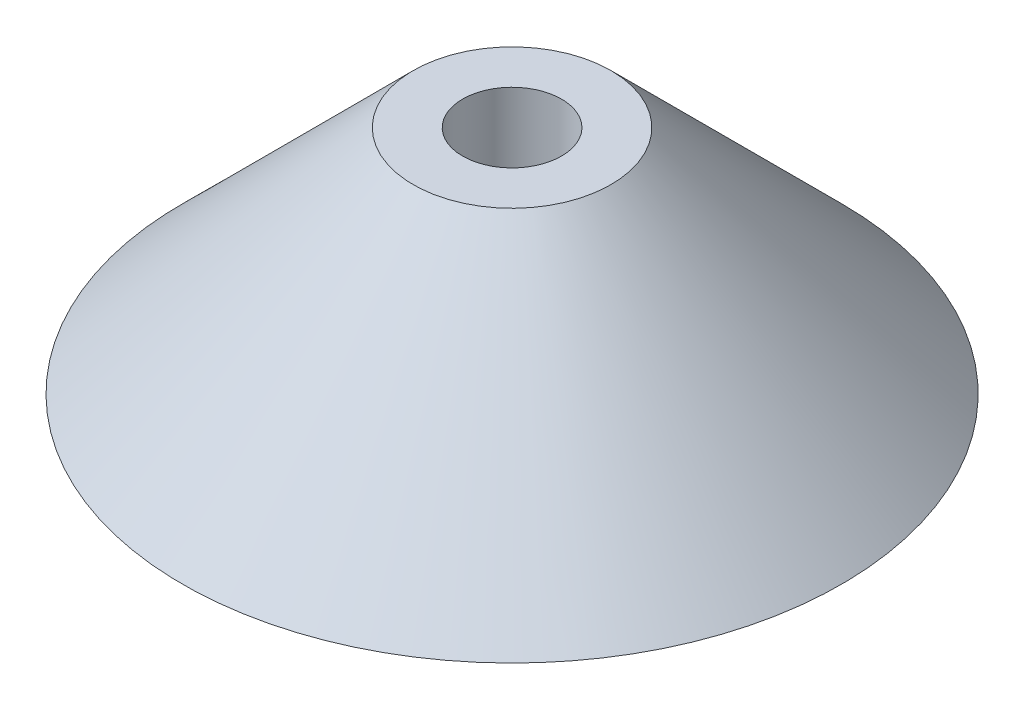
ISO-10303-21;
HEADER;
FILE_DESCRIPTION(('STEP AP214'),'2;1');
FILE_NAME('part.step','',(''),(''),'','','');
FILE_SCHEMA(('AUTOMOTIVE_DESIGN { 1 0 10303 214 1 1 1 1 }'));
ENDSEC;
DATA;
#1=APPLICATION_CONTEXT('core data for automotive mechanical design processes');
#2=APPLICATION_PROTOCOL_DEFINITION('international standard','automotive_design',2000,#1);
#3=PRODUCT_CONTEXT('',#1,'mechanical');
#4=PRODUCT('Part','Part','',(#3));
#5=PRODUCT_RELATED_PRODUCT_CATEGORY('part','',(#4));
#6=PRODUCT_DEFINITION_FORMATION('','',#4);
#7=PRODUCT_DEFINITION_CONTEXT('part definition',#1,'design');
#8=PRODUCT_DEFINITION('design','',#6,#7);
#9=PRODUCT_DEFINITION_SHAPE('','',#8);
#10=(LENGTH_UNIT() NAMED_UNIT(*) SI_UNIT(.MILLI.,.METRE.));
#11=(NAMED_UNIT(*) PLANE_ANGLE_UNIT() SI_UNIT($,.RADIAN.));
#12=(NAMED_UNIT(*) SI_UNIT($,.STERADIAN.) SOLID_ANGLE_UNIT());
#13=UNCERTAINTY_MEASURE_WITH_UNIT(LENGTH_MEASURE(1.E-05),#10,'distance_accuracy_value','');
#14=(GEOMETRIC_REPRESENTATION_CONTEXT(3) GLOBAL_UNCERTAINTY_ASSIGNED_CONTEXT((#13)) GLOBAL_UNIT_ASSIGNED_CONTEXT((#10,
#11,#12)) REPRESENTATION_CONTEXT('',''));
#15=CARTESIAN_POINT('',(0.,0.,0.));
#16=DIRECTION('',(0.,0.,1.));
#17=DIRECTION('',(1.,0.,0.));
#18=AXIS2_PLACEMENT_3D('',#15,#16,#17);
#19=CARTESIAN_POINT('',(0.,7.,0.));
#20=DIRECTION('',(0.,1.,0.));
#21=DIRECTION('',(0.,0.,1.));
#22=AXIS2_PLACEMENT_3D('',#19,#20,#21);
#23=PLANE('',#22);
#24=CARTESIAN_POINT('',(0.,7.,0.));
#25=DIRECTION('',(0.,1.,0.));
#26=DIRECTION('',(0.,0.,1.));
#27=AXIS2_PLACEMENT_3D('',#24,#25,#26);
#28=CIRCLE('',#27,1.5);
#29=CARTESIAN_POINT('',(0.,7.,1.5));
#30=VERTEX_POINT('',#29);
#31=EDGE_CURVE('E46',#30,#30,#28,.T.);
#32=ORIENTED_EDGE('',*,*,#31,.F.);
#33=EDGE_LOOP('',(#32));
#34=FACE_BOUND('',#33,.T.);
#35=CARTESIAN_POINT('',(0.,7.,0.));
#36=DIRECTION('',(0.,1.,0.));
#37=DIRECTION('',(0.,0.,1.));
#38=AXIS2_PLACEMENT_3D('',#35,#36,#37);
#39=CIRCLE('',#38,3.00000000000001);
#40=CARTESIAN_POINT('',(0.,7.,-3.00000000000001));
#41=VERTEX_POINT('',#40);
#42=EDGE_CURVE('E10',#41,#41,#39,.T.);
#43=ORIENTED_EDGE('',*,*,#42,.T.);
#44=EDGE_LOOP('',(#43));
#45=FACE_BOUND('',#44,.T.);
#46=ADVANCED_FACE('F31',(#34,#45),#23,.T.);
#47=CARTESIAN_POINT('',(0.,0.,0.));
#48=DIRECTION('',(0.,1.,0.));
#49=DIRECTION('',(0.,0.,1.));
#50=AXIS2_PLACEMENT_3D('',#47,#48,#49);
#51=PLANE('',#50);
#52=CARTESIAN_POINT('',(0.,0.,0.));
#53=DIRECTION('',(0.,1.,0.));
#54=DIRECTION('',(0.,0.,1.));
#55=AXIS2_PLACEMENT_3D('',#52,#53,#54);
#56=CIRCLE('',#55,1.5);
#57=CARTESIAN_POINT('',(0.,0.,1.5));
#58=VERTEX_POINT('',#57);
#59=EDGE_CURVE('E42',#58,#58,#56,.T.);
#60=ORIENTED_EDGE('',*,*,#59,.T.);
#61=EDGE_LOOP('',(#60));
#62=FACE_BOUND('',#61,.T.);
#63=CARTESIAN_POINT('',(0.,0.,0.));
#64=DIRECTION('',(0.,1.,0.));
#65=DIRECTION('',(0.,0.,1.));
#66=AXIS2_PLACEMENT_3D('',#63,#64,#65);
#67=CIRCLE('',#66,10.);
#68=CARTESIAN_POINT('',(0.,0.,-9.99999999999999));
#69=VERTEX_POINT('',#68);
#70=EDGE_CURVE('E38',#69,#69,#67,.T.);
#71=ORIENTED_EDGE('',*,*,#70,.F.);
#72=EDGE_LOOP('',(#71));
#73=FACE_BOUND('',#72,.T.);
#74=ADVANCED_FACE('F55',(#62,#73),#51,.F.);
#75=CARTESIAN_POINT('',(0.,7.,0.));
#76=DIRECTION('',(0.,-1.,0.));
#77=DIRECTION('',(0.,0.,-1.));
#78=AXIS2_PLACEMENT_3D('',#75,#76,#77);
#79=CONICAL_SURFACE('',#78,3.00000000000001,0.785398163397447);
#80=CARTESIAN_POINT('',(0.,0.,-9.99999999999999));
#81=CARTESIAN_POINT('',(0.,0.072916666666666,-9.92708333333332));
#82=CARTESIAN_POINT('',(0.,0.145833333333333,-9.85416666666665));
#83=CARTESIAN_POINT('',(0.,0.291666666666666,-9.70833333333332));
#84=CARTESIAN_POINT('',(0.,0.364583333333333,-9.63541666666666));
#85=CARTESIAN_POINT('',(0.,0.510416666666666,-9.48958333333332));
#86=CARTESIAN_POINT('',(0.,0.583333333333333,-9.41666666666665));
#87=CARTESIAN_POINT('',(0.,0.729166666666666,-9.27083333333332));
#88=CARTESIAN_POINT('',(0.,0.802083333333333,-9.19791666666666));
#89=CARTESIAN_POINT('',(0.,0.947916666666666,-9.05208333333332));
#90=CARTESIAN_POINT('',(0.,1.02083333333333,-8.97916666666666));
#91=CARTESIAN_POINT('',(0.,1.16666666666667,-8.83333333333332));
#92=CARTESIAN_POINT('',(0.,1.23958333333333,-8.76041666666666));
#93=CARTESIAN_POINT('',(0.,1.38541666666667,-8.61458333333332));
#94=CARTESIAN_POINT('',(0.,1.45833333333333,-8.54166666666666));
#95=CARTESIAN_POINT('',(0.,1.60416666666667,-8.39583333333333));
#96=CARTESIAN_POINT('',(0.,1.67708333333333,-8.32291666666666));
#97=CARTESIAN_POINT('',(0.,1.82291666666667,-8.17708333333333));
#98=CARTESIAN_POINT('',(0.,1.89583333333333,-8.10416666666666));
#99=CARTESIAN_POINT('',(0.,2.04166666666667,-7.95833333333333));
#100=CARTESIAN_POINT('',(0.,2.11458333333333,-7.88541666666666));
#101=CARTESIAN_POINT('',(0.,2.26041666666667,-7.73958333333333));
#102=CARTESIAN_POINT('',(0.,2.33333333333333,-7.66666666666666));
#103=CARTESIAN_POINT('',(0.,2.47916666666667,-7.52083333333333));
#104=CARTESIAN_POINT('',(0.,2.55208333333333,-7.44791666666666));
#105=CARTESIAN_POINT('',(0.,2.69791666666667,-7.30208333333333));
#106=CARTESIAN_POINT('',(0.,2.77083333333333,-7.22916666666666));
#107=CARTESIAN_POINT('',(0.,2.91666666666667,-7.08333333333333));
#108=CARTESIAN_POINT('',(0.,2.98958333333333,-7.01041666666666));
#109=CARTESIAN_POINT('',(0.,3.13541666666667,-6.86458333333333));
#110=CARTESIAN_POINT('',(0.,3.20833333333333,-6.79166666666666));
#111=CARTESIAN_POINT('',(0.,3.35416666666667,-6.64583333333333));
#112=CARTESIAN_POINT('',(0.,3.42708333333333,-6.57291666666666));
#113=CARTESIAN_POINT('',(0.,3.57291666666667,-6.42708333333333));
#114=CARTESIAN_POINT('',(0.,3.64583333333333,-6.35416666666667));
#115=CARTESIAN_POINT('',(0.,3.79166666666667,-6.20833333333333));
#116=CARTESIAN_POINT('',(0.,3.86458333333333,-6.13541666666667));
#117=CARTESIAN_POINT('',(0.,4.01041666666667,-5.98958333333333));
#118=CARTESIAN_POINT('',(0.,4.08333333333333,-5.91666666666667));
#119=CARTESIAN_POINT('',(0.,4.22916666666667,-5.77083333333333));
#120=CARTESIAN_POINT('',(0.,4.30208333333333,-5.69791666666667));
#121=CARTESIAN_POINT('',(0.,4.44791666666667,-5.55208333333333));
#122=CARTESIAN_POINT('',(0.,4.52083333333333,-5.47916666666667));
#123=CARTESIAN_POINT('',(0.,4.66666666666667,-5.33333333333333));
#124=CARTESIAN_POINT('',(0.,4.73958333333333,-5.26041666666667));
#125=CARTESIAN_POINT('',(0.,4.88541666666667,-5.11458333333334));
#126=CARTESIAN_POINT('',(0.,4.95833333333333,-5.04166666666667));
#127=CARTESIAN_POINT('',(0.,5.10416666666667,-4.89583333333334));
#128=CARTESIAN_POINT('',(0.,5.17708333333333,-4.82291666666667));
#129=CARTESIAN_POINT('',(0.,5.32291666666667,-4.67708333333334));
#130=CARTESIAN_POINT('',(0.,5.39583333333333,-4.60416666666667));
#131=CARTESIAN_POINT('',(0.,5.54166666666667,-4.45833333333334));
#132=CARTESIAN_POINT('',(0.,5.61458333333333,-4.38541666666667));
#133=CARTESIAN_POINT('',(0.,5.76041666666667,-4.23958333333334));
#134=CARTESIAN_POINT('',(0.,5.83333333333333,-4.16666666666667));
#135=CARTESIAN_POINT('',(0.,5.97916666666667,-4.02083333333334));
#136=CARTESIAN_POINT('',(0.,6.05208333333333,-3.94791666666667));
#137=CARTESIAN_POINT('',(0.,6.19791666666667,-3.80208333333334));
#138=CARTESIAN_POINT('',(0.,6.27083333333333,-3.72916666666667));
#139=CARTESIAN_POINT('',(0.,6.41666666666667,-3.58333333333334));
#140=CARTESIAN_POINT('',(0.,6.48958333333333,-3.51041666666667));
#141=CARTESIAN_POINT('',(0.,6.63541666666667,-3.36458333333334));
#142=CARTESIAN_POINT('',(0.,6.70833333333333,-3.29166666666668));
#143=CARTESIAN_POINT('',(0.,6.85416666666667,-3.14583333333334));
#144=CARTESIAN_POINT('',(0.,6.92708333333333,-3.07291666666668));
#145=CARTESIAN_POINT('',(0.,7.,-3.00000000000001));
#146=B_SPLINE_CURVE_WITH_KNOTS('',3,(#80,#81,#82,#83,#84,#85,#86,#87,#88,#89,#90,#91,#92,#93,
#94,#95,#96,#97,#98,#99,#100,#101,#102,#103,#104,#105,#106,#107,#108,#109,#110,#111,#112,#113,
#114,#115,#116,#117,#118,#119,#120,#121,#122,#123,#124,#125,#126,#127,#128,#129,#130,#131,#132,
#133,#134,#135,#136,#137,#138,#139,#140,#141,#142,#143,#144,#145),.UNSPECIFIED.,.F.,.F.,(4,2,2,
2,2,2,2,2,2,2,2,2,2,2,2,2,2,2,2,2,2,2,2,2,2,2,2,2,2,2,2,2,4),(0.,0.309359216769114,
0.618718433538228,0.928077650307343,1.23743686707645,1.54679608384557,1.85615530061468,
2.1655145173838,2.47487373415291,2.78423295092203,3.09359216769114,3.40295138446025,
3.71231060122937,4.02166981799848,4.3310290347676,4.64038825153671,4.94974746830582,
5.25910668507494,5.56846590184405,5.87782511861317,6.18718433538228,6.4965435521514,
6.80590276892051,7.11526198568962,7.42462120245874,7.73398041922785,8.04333963599696,
8.35269885276608,8.66205806953519,8.97141728630431,9.28077650307342,9.59013571984253,
9.89949493661165),.UNSPECIFIED.);
#147=EDGE_CURVE('BSEAM33',#69,#41,#146,.T.);
#148=ORIENTED_EDGE('',*,*,#70,.T.);
#149=ORIENTED_EDGE('',*,*,#42,.F.);
#150=ORIENTED_EDGE('',*,*,#147,.T.);
#151=ORIENTED_EDGE('',*,*,#147,.F.);
#152=EDGE_LOOP('',(#148,#150,#149,#151));
#153=FACE_BOUND('',#152,.T.);
#154=ADVANCED_FACE('F33',(#153),#79,.T.);
#155=CARTESIAN_POINT('',(0.,0.,0.));
#156=DIRECTION('',(0.,1.,0.));
#157=DIRECTION('',(0.,0.,1.));
#158=AXIS2_PLACEMENT_3D('',#155,#156,#157);
#159=CYLINDRICAL_SURFACE('',#158,1.5);
#160=ORIENTED_EDGE('',*,*,#59,.F.);
#161=EDGE_LOOP('',(#160));
#162=FACE_BOUND('',#161,.T.);
#163=ORIENTED_EDGE('',*,*,#31,.T.);
#164=EDGE_LOOP('',(#163));
#165=FACE_BOUND('',#164,.T.);
#166=ADVANCED_FACE('F52',(#162,#165),#159,.F.);
#167=CLOSED_SHELL('',(#46,#74,#154,#166));
#168=MANIFOLD_SOLID_BREP('B2',#167);
#169=ADVANCED_BREP_SHAPE_REPRESENTATION('',(#18,#168),#14);
#170=SHAPE_DEFINITION_REPRESENTATION(#9,#169);
ENDSEC;
END-ISO-10303-21;
